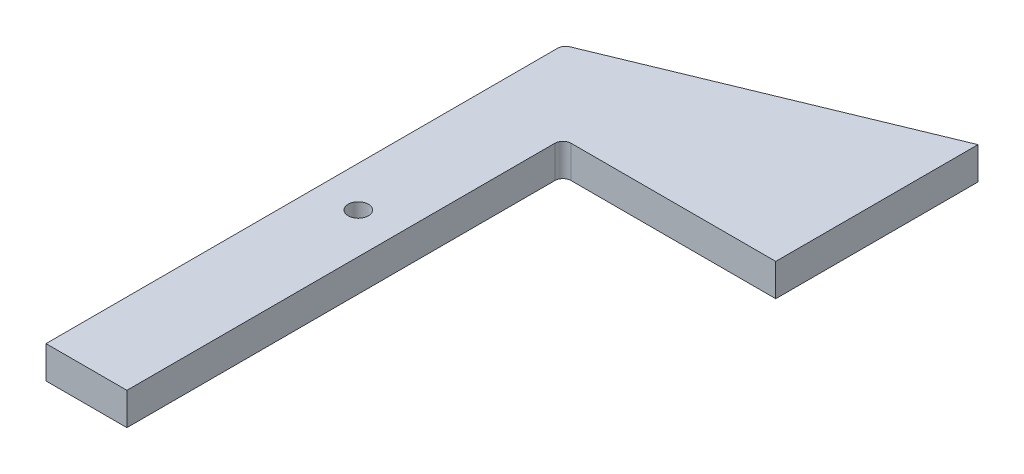
ISO-10303-21;
HEADER;
FILE_DESCRIPTION(('STEP AP214'),'2;1');
FILE_NAME('part.step','',(''),(''),'','','');
FILE_SCHEMA(('AUTOMOTIVE_DESIGN { 1 0 10303 214 1 1 1 1 }'));
ENDSEC;
DATA;
#1=APPLICATION_CONTEXT('core data for automotive mechanical design processes');
#2=APPLICATION_PROTOCOL_DEFINITION('international standard','automotive_design',2000,#1);
#3=PRODUCT_CONTEXT('',#1,'mechanical');
#4=PRODUCT('Part','Part','',(#3));
#5=PRODUCT_RELATED_PRODUCT_CATEGORY('part','',(#4));
#6=PRODUCT_DEFINITION_FORMATION('','',#4);
#7=PRODUCT_DEFINITION_CONTEXT('part definition',#1,'design');
#8=PRODUCT_DEFINITION('design','',#6,#7);
#9=PRODUCT_DEFINITION_SHAPE('','',#8);
#10=(LENGTH_UNIT() NAMED_UNIT(*) SI_UNIT(.MILLI.,.METRE.));
#11=(NAMED_UNIT(*) PLANE_ANGLE_UNIT() SI_UNIT($,.RADIAN.));
#12=(NAMED_UNIT(*) SI_UNIT($,.STERADIAN.) SOLID_ANGLE_UNIT());
#13=UNCERTAINTY_MEASURE_WITH_UNIT(LENGTH_MEASURE(1.E-05),#10,'distance_accuracy_value','');
#14=(GEOMETRIC_REPRESENTATION_CONTEXT(3) GLOBAL_UNCERTAINTY_ASSIGNED_CONTEXT((#13)) GLOBAL_UNIT_ASSIGNED_CONTEXT((#10,
#11,#12)) REPRESENTATION_CONTEXT('',''));
#15=CARTESIAN_POINT('',(0.,0.,0.));
#16=DIRECTION('',(0.,0.,1.));
#17=DIRECTION('',(1.,0.,0.));
#18=AXIS2_PLACEMENT_3D('',#15,#16,#17);
#19=CARTESIAN_POINT('',(-50.,10.16,-128.026));
#20=DIRECTION('',(1.,0.,0.));
#21=DIRECTION('',(0.,0.,-1.));
#22=AXIS2_PLACEMENT_3D('',#19,#20,#21);
#23=PLANE('',#22);
#24=DIRECTION('',(0.,0.,1.));
#25=VECTOR('',#24,1.);
#26=CARTESIAN_POINT('',(-50.,10.16,-128.026));
#27=LINE('',#26,#25);
#28=CARTESIAN_POINT('',(-50.,10.16,-126.327272311199));
#29=VERTEX_POINT('',#28);
#30=CARTESIAN_POINT('',(-50.,10.16,34.28));
#31=VERTEX_POINT('',#30);
#32=EDGE_CURVE('E104',#29,#31,#27,.T.);
#33=ORIENTED_EDGE('',*,*,#32,.F.);
#34=DIRECTION('',(0.,-1.,0.));
#35=VECTOR('',#34,1.);
#36=CARTESIAN_POINT('',(-50.,10.16,-126.327272311199));
#37=LINE('',#36,#35);
#38=CARTESIAN_POINT('',(-50.,0.,-126.327272311199));
#39=VERTEX_POINT('',#38);
#40=EDGE_CURVE('E129',#29,#39,#37,.T.);
#41=ORIENTED_EDGE('',*,*,#40,.T.);
#42=DIRECTION('',(0.,0.,1.));
#43=VECTOR('',#42,1.);
#44=CARTESIAN_POINT('',(-50.,0.,-128.026));
#45=LINE('',#44,#43);
#46=CARTESIAN_POINT('',(-50.,0.,34.28));
#47=VERTEX_POINT('',#46);
#48=EDGE_CURVE('E127',#39,#47,#45,.T.);
#49=ORIENTED_EDGE('',*,*,#48,.T.);
#50=DIRECTION('',(0.,-1.,0.));
#51=VECTOR('',#50,1.);
#52=CARTESIAN_POINT('',(-50.,10.16,34.28));
#53=LINE('',#52,#51);
#54=EDGE_CURVE('E121',#31,#47,#53,.T.);
#55=ORIENTED_EDGE('',*,*,#54,.F.);
#56=EDGE_LOOP('',(#33,#41,#49,#55));
#57=FACE_BOUND('',#56,.T.);
#58=ADVANCED_FACE('F41',(#57),#23,.F.);
#59=CARTESIAN_POINT('',(-50.,10.16,34.28));
#60=DIRECTION('',(0.,0.,-1.));
#61=DIRECTION('',(-1.,0.,0.));
#62=AXIS2_PLACEMENT_3D('',#59,#60,#61);
#63=PLANE('',#62);
#64=DIRECTION('',(1.,0.,0.));
#65=VECTOR('',#64,1.);
#66=CARTESIAN_POINT('',(-50.,0.,34.28));
#67=LINE('',#66,#65);
#68=CARTESIAN_POINT('',(-24.6,0.,34.28));
#69=VERTEX_POINT('',#68);
#70=EDGE_CURVE('E154',#47,#69,#67,.T.);
#71=ORIENTED_EDGE('',*,*,#70,.T.);
#72=DIRECTION('',(0.,-1.,0.));
#73=VECTOR('',#72,1.);
#74=CARTESIAN_POINT('',(-24.6,10.16,34.28));
#75=LINE('',#74,#73);
#76=CARTESIAN_POINT('',(-24.6,10.16,34.28));
#77=VERTEX_POINT('',#76);
#78=EDGE_CURVE('E123',#77,#69,#75,.T.);
#79=ORIENTED_EDGE('',*,*,#78,.F.);
#80=DIRECTION('',(1.,0.,0.));
#81=VECTOR('',#80,1.);
#82=CARTESIAN_POINT('',(-50.,10.16,34.28));
#83=LINE('',#82,#81);
#84=EDGE_CURVE('E108',#31,#77,#83,.T.);
#85=ORIENTED_EDGE('',*,*,#84,.F.);
#86=ORIENTED_EDGE('',*,*,#54,.T.);
#87=EDGE_LOOP('',(#71,#79,#85,#86));
#88=FACE_BOUND('',#87,.T.);
#89=ADVANCED_FACE('F120',(#88),#63,.F.);
#90=CARTESIAN_POINT('',(-24.6,10.16,-102.626));
#91=DIRECTION('',(-1.,0.,0.));
#92=DIRECTION('',(0.,0.,1.));
#93=AXIS2_PLACEMENT_3D('',#90,#91,#92);
#94=PLANE('',#93);
#95=DIRECTION('',(0.,0.,-1.));
#96=VECTOR('',#95,1.);
#97=CARTESIAN_POINT('',(-24.6,0.,-102.626));
#98=LINE('',#97,#96);
#99=CARTESIAN_POINT('',(-24.6,0.,-100.086));
#100=VERTEX_POINT('',#99);
#101=EDGE_CURVE('E148',#69,#100,#98,.T.);
#102=ORIENTED_EDGE('',*,*,#101,.T.);
#103=DIRECTION('',(0.,-1.,0.));
#104=VECTOR('',#103,1.);
#105=CARTESIAN_POINT('',(-24.6,10.16,-100.086));
#106=LINE('',#105,#104);
#107=CARTESIAN_POINT('',(-24.6,10.16,-100.086));
#108=VERTEX_POINT('',#107);
#109=EDGE_CURVE('E62',#100,#108,#106,.F.);
#110=ORIENTED_EDGE('',*,*,#109,.T.);
#111=DIRECTION('',(0.,0.,-1.));
#112=VECTOR('',#111,1.);
#113=CARTESIAN_POINT('',(-24.6,10.16,-102.626));
#114=LINE('',#113,#112);
#115=EDGE_CURVE('E124',#77,#108,#114,.T.);
#116=ORIENTED_EDGE('',*,*,#115,.F.);
#117=ORIENTED_EDGE('',*,*,#78,.T.);
#118=EDGE_LOOP('',(#102,#110,#116,#117));
#119=FACE_BOUND('',#118,.T.);
#120=ADVANCED_FACE('F153',(#119),#94,.F.);
#121=CARTESIAN_POINT('',(-24.6,10.16,-102.626));
#122=DIRECTION('',(0.,0.,-1.));
#123=DIRECTION('',(-1.,0.,0.));
#124=AXIS2_PLACEMENT_3D('',#121,#122,#123);
#125=PLANE('',#124);
#126=DIRECTION('',(1.,0.,0.));
#127=VECTOR('',#126,1.);
#128=CARTESIAN_POINT('',(-24.6,10.16,-102.626));
#129=LINE('',#128,#127);
#130=CARTESIAN_POINT('',(-22.06,10.16,-102.626));
#131=VERTEX_POINT('',#130);
#132=CARTESIAN_POINT('',(42.202,10.16,-102.626));
#133=VERTEX_POINT('',#132);
#134=EDGE_CURVE('E159',#131,#133,#129,.T.);
#135=ORIENTED_EDGE('',*,*,#134,.F.);
#136=DIRECTION('',(0.,-1.,0.));
#137=VECTOR('',#136,1.);
#138=CARTESIAN_POINT('',(-22.06,0.,-102.626));
#139=LINE('',#138,#137);
#140=CARTESIAN_POINT('',(-22.06,0.,-102.626));
#141=VERTEX_POINT('',#140);
#142=EDGE_CURVE('E141',#131,#141,#139,.T.);
#143=ORIENTED_EDGE('',*,*,#142,.T.);
#144=DIRECTION('',(1.,0.,0.));
#145=VECTOR('',#144,1.);
#146=CARTESIAN_POINT('',(-24.6,0.,-102.626));
#147=LINE('',#146,#145);
#148=CARTESIAN_POINT('',(42.202,0.,-102.626));
#149=VERTEX_POINT('',#148);
#150=EDGE_CURVE('E150',#141,#149,#147,.T.);
#151=ORIENTED_EDGE('',*,*,#150,.T.);
#152=DIRECTION('',(0.,-1.,0.));
#153=VECTOR('',#152,1.);
#154=CARTESIAN_POINT('',(42.202,10.16,-102.626));
#155=LINE('',#154,#153);
#156=EDGE_CURVE('E133',#133,#149,#155,.T.);
#157=ORIENTED_EDGE('',*,*,#156,.F.);
#158=EDGE_LOOP('',(#135,#143,#151,#157));
#159=FACE_BOUND('',#158,.T.);
#160=ADVANCED_FACE('F157',(#159),#125,.F.);
#161=CARTESIAN_POINT('',(42.202,10.16,-128.026));
#162=DIRECTION('',(-1.,0.,0.));
#163=DIRECTION('',(0.,0.,1.));
#164=AXIS2_PLACEMENT_3D('',#161,#162,#163);
#165=PLANE('',#164);
#166=DIRECTION('',(0.,0.,-1.));
#167=VECTOR('',#166,1.);
#168=CARTESIAN_POINT('',(42.202,0.,-128.026));
#169=LINE('',#168,#167);
#170=CARTESIAN_POINT('',(42.202,0.,-166.126));
#171=VERTEX_POINT('',#170);
#172=EDGE_CURVE('E174',#149,#171,#169,.T.);
#173=ORIENTED_EDGE('',*,*,#172,.T.);
#174=DIRECTION('',(0.,-1.,0.));
#175=VECTOR('',#174,1.);
#176=CARTESIAN_POINT('',(42.202,10.16,-166.126));
#177=LINE('',#176,#175);
#178=CARTESIAN_POINT('',(42.202,10.16,-166.126));
#179=VERTEX_POINT('',#178);
#180=EDGE_CURVE('E169',#179,#171,#177,.T.);
#181=ORIENTED_EDGE('',*,*,#180,.F.);
#182=DIRECTION('',(0.,0.,-1.));
#183=VECTOR('',#182,1.);
#184=CARTESIAN_POINT('',(42.202,10.16,-128.026));
#185=LINE('',#184,#183);
#186=EDGE_CURVE('E162',#133,#179,#185,.T.);
#187=ORIENTED_EDGE('',*,*,#186,.F.);
#188=ORIENTED_EDGE('',*,*,#156,.T.);
#189=EDGE_LOOP('',(#173,#181,#187,#188));
#190=FACE_BOUND('',#189,.T.);
#191=ADVANCED_FACE('F180',(#190),#165,.F.);
#192=CARTESIAN_POINT('',(-50.,10.16,-128.026));
#193=DIRECTION('',(0.381901994831326,0.,0.924202827491809));
#194=DIRECTION('',(0.924202827491809,0.,-0.381901994831326));
#195=AXIS2_PLACEMENT_3D('',#192,#193,#194);
#196=PLANE('',#195);
#197=DIRECTION('',(-0.924202827491809,0.,0.381901994831326));
#198=VECTOR('',#197,1.);
#199=CARTESIAN_POINT('',(-50.,0.,-128.026));
#200=LINE('',#199,#198);
#201=CARTESIAN_POINT('',(-48.4300310668716,0.,-128.674747493028));
#202=VERTEX_POINT('',#201);
#203=EDGE_CURVE('E116',#171,#202,#200,.T.);
#204=ORIENTED_EDGE('',*,*,#203,.T.);
#205=DIRECTION('',(0.,-1.,0.));
#206=VECTOR('',#205,1.);
#207=CARTESIAN_POINT('',(-48.4300310668716,10.16,-128.674747493028));
#208=LINE('',#207,#206);
#209=CARTESIAN_POINT('',(-48.4300310668716,10.16,-128.674747493028));
#210=VERTEX_POINT('',#209);
#211=EDGE_CURVE('E138',#202,#210,#208,.F.);
#212=ORIENTED_EDGE('',*,*,#211,.T.);
#213=DIRECTION('',(-0.924202827491809,0.,0.381901994831326));
#214=VECTOR('',#213,1.);
#215=CARTESIAN_POINT('',(-50.,10.16,-128.026));
#216=LINE('',#215,#214);
#217=EDGE_CURVE('E164',#179,#210,#216,.T.);
#218=ORIENTED_EDGE('',*,*,#217,.F.);
#219=ORIENTED_EDGE('',*,*,#180,.T.);
#220=EDGE_LOOP('',(#204,#212,#218,#219));
#221=FACE_BOUND('',#220,.T.);
#222=ADVANCED_FACE('F188',(#221),#196,.F.);
#223=CARTESIAN_POINT('',(0.,10.16,0.));
#224=DIRECTION('',(0.,1.,0.));
#225=DIRECTION('',(0.,0.,1.));
#226=AXIS2_PLACEMENT_3D('',#223,#224,#225);
#227=PLANE('',#226);
#228=CARTESIAN_POINT('',(-37.3,10.16,-51.064));
#229=DIRECTION('',(0.,1.,0.));
#230=DIRECTION('',(0.,0.,1.));
#231=AXIS2_PLACEMENT_3D('',#228,#229,#230);
#232=CIRCLE('',#231,3.175);
#233=CARTESIAN_POINT('',(-37.3,10.16,-47.889));
#234=VERTEX_POINT('',#233);
#235=EDGE_CURVE('E225',#234,#234,#232,.T.);
#236=ORIENTED_EDGE('',*,*,#235,.F.);
#237=EDGE_LOOP('',(#236));
#238=FACE_BOUND('',#237,.T.);
#239=ORIENTED_EDGE('',*,*,#217,.T.);
#240=CARTESIAN_POINT('',(-47.46,10.16,-126.327272311199));
#241=DIRECTION('',(0.,1.,0.));
#242=DIRECTION('',(0.,0.,1.));
#243=AXIS2_PLACEMENT_3D('',#240,#241,#242);
#244=CIRCLE('',#243,2.54);
#245=EDGE_CURVE('E111',#210,#29,#244,.T.);
#246=ORIENTED_EDGE('',*,*,#245,.T.);
#247=ORIENTED_EDGE('',*,*,#32,.T.);
#248=ORIENTED_EDGE('',*,*,#84,.T.);
#249=ORIENTED_EDGE('',*,*,#115,.T.);
#250=CARTESIAN_POINT('',(-22.06,10.16,-100.086));
#251=DIRECTION('',(0.,1.,0.));
#252=DIRECTION('',(0.,0.,1.));
#253=AXIS2_PLACEMENT_3D('',#250,#251,#252);
#254=CIRCLE('',#253,2.54);
#255=EDGE_CURVE('E11',#108,#131,#254,.F.);
#256=ORIENTED_EDGE('',*,*,#255,.T.);
#257=ORIENTED_EDGE('',*,*,#134,.T.);
#258=ORIENTED_EDGE('',*,*,#186,.T.);
#259=EDGE_LOOP('',(#239,#246,#247,#248,#249,#256,#257,#258));
#260=FACE_BOUND('',#259,.T.);
#261=ADVANCED_FACE('F107',(#238,#260),#227,.T.);
#262=CARTESIAN_POINT('',(0.,0.,0.));
#263=DIRECTION('',(0.,1.,0.));
#264=DIRECTION('',(0.,0.,1.));
#265=AXIS2_PLACEMENT_3D('',#262,#263,#264);
#266=PLANE('',#265);
#267=CARTESIAN_POINT('',(-37.3,0.,-51.064));
#268=DIRECTION('',(0.,1.,0.));
#269=DIRECTION('',(0.,0.,1.));
#270=AXIS2_PLACEMENT_3D('',#267,#268,#269);
#271=CIRCLE('',#270,3.175);
#272=CARTESIAN_POINT('',(-37.3,0.,-47.889));
#273=VERTEX_POINT('',#272);
#274=EDGE_CURVE('E171',#273,#273,#271,.T.);
#275=ORIENTED_EDGE('',*,*,#274,.T.);
#276=EDGE_LOOP('',(#275));
#277=FACE_BOUND('',#276,.T.);
#278=ORIENTED_EDGE('',*,*,#48,.F.);
#279=CARTESIAN_POINT('',(-47.46,0.,-126.327272311199));
#280=DIRECTION('',(0.,1.,0.));
#281=DIRECTION('',(0.,0.,1.));
#282=AXIS2_PLACEMENT_3D('',#279,#280,#281);
#283=CIRCLE('',#282,2.54);
#284=EDGE_CURVE('E131',#39,#202,#283,.F.);
#285=ORIENTED_EDGE('',*,*,#284,.T.);
#286=ORIENTED_EDGE('',*,*,#203,.F.);
#287=ORIENTED_EDGE('',*,*,#172,.F.);
#288=ORIENTED_EDGE('',*,*,#150,.F.);
#289=CARTESIAN_POINT('',(-22.06,0.,-100.086));
#290=DIRECTION('',(0.,1.,0.));
#291=DIRECTION('',(0.,0.,1.));
#292=AXIS2_PLACEMENT_3D('',#289,#290,#291);
#293=CIRCLE('',#292,2.54);
#294=EDGE_CURVE('E49',#141,#100,#293,.T.);
#295=ORIENTED_EDGE('',*,*,#294,.T.);
#296=ORIENTED_EDGE('',*,*,#101,.F.);
#297=ORIENTED_EDGE('',*,*,#70,.F.);
#298=EDGE_LOOP('',(#278,#285,#286,#287,#288,#295,#296,#297));
#299=FACE_BOUND('',#298,.T.);
#300=ADVANCED_FACE('F147',(#277,#299),#266,.F.);
#301=CARTESIAN_POINT('',(-37.3,0.,-51.064));
#302=DIRECTION('',(0.,1.,0.));
#303=DIRECTION('',(0.,0.,1.));
#304=AXIS2_PLACEMENT_3D('',#301,#302,#303);
#305=CYLINDRICAL_SURFACE('',#304,3.175);
#306=ORIENTED_EDGE('',*,*,#274,.F.);
#307=EDGE_LOOP('',(#306));
#308=FACE_BOUND('',#307,.T.);
#309=ORIENTED_EDGE('',*,*,#235,.T.);
#310=EDGE_LOOP('',(#309));
#311=FACE_BOUND('',#310,.T.);
#312=ADVANCED_FACE('F210',(#308,#311),#305,.F.);
#313=CARTESIAN_POINT('',(-47.46,10.16,-126.327272311199));
#314=DIRECTION('',(0.,-1.,0.));
#315=DIRECTION('',(0.,0.,-1.));
#316=AXIS2_PLACEMENT_3D('',#313,#314,#315);
#317=CYLINDRICAL_SURFACE('',#316,2.54);
#318=ORIENTED_EDGE('',*,*,#245,.F.);
#319=ORIENTED_EDGE('',*,*,#211,.F.);
#320=ORIENTED_EDGE('',*,*,#284,.F.);
#321=ORIENTED_EDGE('',*,*,#40,.F.);
#322=EDGE_LOOP('',(#318,#319,#320,#321));
#323=FACE_BOUND('',#322,.T.);
#324=ADVANCED_FACE('F186',(#323),#317,.T.);
#325=CARTESIAN_POINT('',(-22.06,10.16,-100.086));
#326=DIRECTION('',(0.,1.,0.));
#327=DIRECTION('',(0.,0.,1.));
#328=AXIS2_PLACEMENT_3D('',#325,#326,#327);
#329=CYLINDRICAL_SURFACE('',#328,2.54);
#330=ORIENTED_EDGE('',*,*,#255,.F.);
#331=ORIENTED_EDGE('',*,*,#109,.F.);
#332=ORIENTED_EDGE('',*,*,#294,.F.);
#333=ORIENTED_EDGE('',*,*,#142,.F.);
#334=EDGE_LOOP('',(#330,#331,#332,#333));
#335=FACE_BOUND('',#334,.T.);
#336=ADVANCED_FACE('F43',(#335),#329,.F.);
#337=CLOSED_SHELL('',(#58,#89,#120,#160,#191,#222,#261,#300,#312,#324,#336));
#338=MANIFOLD_SOLID_BREP('B2',#337);
#339=ADVANCED_BREP_SHAPE_REPRESENTATION('',(#18,#338),#14);
#340=SHAPE_DEFINITION_REPRESENTATION(#9,#339);
ENDSEC;
END-ISO-10303-21;
